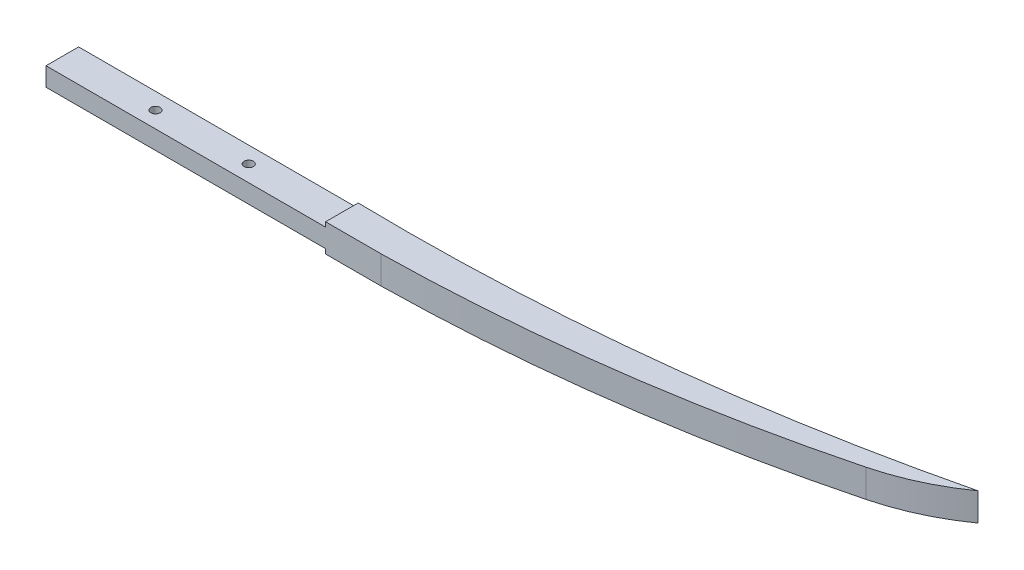
ISO-10303-21;
HEADER;
FILE_DESCRIPTION(('STEP AP214'),'2;1');
FILE_NAME('part.step','',(''),(''),'','','');
FILE_SCHEMA(('AUTOMOTIVE_DESIGN { 1 0 10303 214 1 1 1 1 }'));
ENDSEC;
DATA;
#1=APPLICATION_CONTEXT('core data for automotive mechanical design processes');
#2=APPLICATION_PROTOCOL_DEFINITION('international standard','automotive_design',2000,#1);
#3=PRODUCT_CONTEXT('',#1,'mechanical');
#4=PRODUCT('Part','Part','',(#3));
#5=PRODUCT_RELATED_PRODUCT_CATEGORY('part','',(#4));
#6=PRODUCT_DEFINITION_FORMATION('','',#4);
#7=PRODUCT_DEFINITION_CONTEXT('part definition',#1,'design');
#8=PRODUCT_DEFINITION('design','',#6,#7);
#9=PRODUCT_DEFINITION_SHAPE('','',#8);
#10=(LENGTH_UNIT() NAMED_UNIT(*) SI_UNIT(.MILLI.,.METRE.));
#11=(NAMED_UNIT(*) PLANE_ANGLE_UNIT() SI_UNIT($,.RADIAN.));
#12=(NAMED_UNIT(*) SI_UNIT($,.STERADIAN.) SOLID_ANGLE_UNIT());
#13=UNCERTAINTY_MEASURE_WITH_UNIT(LENGTH_MEASURE(1.E-05),#10,'distance_accuracy_value','');
#14=(GEOMETRIC_REPRESENTATION_CONTEXT(3) GLOBAL_UNCERTAINTY_ASSIGNED_CONTEXT((#13)) GLOBAL_UNIT_ASSIGNED_CONTEXT((#10,
#11,#12)) REPRESENTATION_CONTEXT('',''));
#15=CARTESIAN_POINT('',(0.,0.,0.));
#16=DIRECTION('',(0.,0.,1.));
#17=DIRECTION('',(1.,0.,0.));
#18=AXIS2_PLACEMENT_3D('',#15,#16,#17);
#19=CARTESIAN_POINT('',(0.,30.,0.));
#20=DIRECTION('',(1.,0.,0.));
#21=DIRECTION('',(0.,0.,-1.));
#22=AXIS2_PLACEMENT_3D('',#19,#20,#21);
#23=PLANE('',#22);
#24=DIRECTION('',(0.,0.,1.));
#25=VECTOR('',#24,1.);
#26=CARTESIAN_POINT('',(0.,5.,-35.0000000000001));
#27=LINE('',#26,#25);
#28=CARTESIAN_POINT('',(0.,5.,-35.0000000000001));
#29=VERTEX_POINT('',#28);
#30=CARTESIAN_POINT('',(0.,5.,0.));
#31=VERTEX_POINT('',#30);
#32=EDGE_CURVE('E58',#29,#31,#27,.T.);
#33=ORIENTED_EDGE('',*,*,#32,.F.);
#34=DIRECTION('',(0.,-1.,0.));
#35=VECTOR('',#34,1.);
#36=CARTESIAN_POINT('',(0.,30.,-35.0000000000001));
#37=LINE('',#36,#35);
#38=CARTESIAN_POINT('',(0.,0.,-35.0000000000001));
#39=VERTEX_POINT('',#38);
#40=EDGE_CURVE('E188',#29,#39,#37,.T.);
#41=ORIENTED_EDGE('',*,*,#40,.T.);
#42=DIRECTION('',(0.,0.,1.));
#43=VECTOR('',#42,1.);
#44=CARTESIAN_POINT('',(0.,0.,0.));
#45=LINE('',#44,#43);
#46=CARTESIAN_POINT('',(0.,0.,0.));
#47=VERTEX_POINT('',#46);
#48=EDGE_CURVE('E178',#39,#47,#45,.T.);
#49=ORIENTED_EDGE('',*,*,#48,.T.);
#50=DIRECTION('',(0.,-1.,0.));
#51=VECTOR('',#50,1.);
#52=CARTESIAN_POINT('',(0.,30.,0.));
#53=LINE('',#52,#51);
#54=EDGE_CURVE('E63',#31,#47,#53,.T.);
#55=ORIENTED_EDGE('',*,*,#54,.F.);
#56=EDGE_LOOP('',(#33,#41,#49,#55));
#57=FACE_BOUND('',#56,.T.);
#58=ADVANCED_FACE('F41',(#57),#23,.F.);
#59=DIRECTION('',(0.,0.,-1.));
#60=VECTOR('',#59,1.);
#61=CARTESIAN_POINT('',(0.,25.,0.));
#62=LINE('',#61,#60);
#63=CARTESIAN_POINT('',(0.,25.,0.));
#64=VERTEX_POINT('',#63);
#65=CARTESIAN_POINT('',(0.,25.,-35.0000000000001));
#66=VERTEX_POINT('',#65);
#67=EDGE_CURVE('E225',#64,#66,#62,.T.);
#68=ORIENTED_EDGE('',*,*,#67,.F.);
#69=CARTESIAN_POINT('',(0.,30.,0.));
#70=VERTEX_POINT('',#69);
#71=EDGE_CURVE('E139',#70,#64,#53,.T.);
#72=ORIENTED_EDGE('',*,*,#71,.F.);
#73=DIRECTION('',(0.,0.,1.));
#74=VECTOR('',#73,1.);
#75=CARTESIAN_POINT('',(0.,30.,0.));
#76=LINE('',#75,#74);
#77=CARTESIAN_POINT('',(0.,30.,-35.0000000000001));
#78=VERTEX_POINT('',#77);
#79=EDGE_CURVE('E164',#78,#70,#76,.T.);
#80=ORIENTED_EDGE('',*,*,#79,.F.);
#81=EDGE_CURVE('E189',#78,#66,#37,.T.);
#82=ORIENTED_EDGE('',*,*,#81,.T.);
#83=EDGE_LOOP('',(#68,#72,#80,#82));
#84=FACE_BOUND('',#83,.T.);
#85=ADVANCED_FACE('F260',(#84),#23,.F.);
#86=CARTESIAN_POINT('',(29.7232753436048,30.,-1949.77345527701));
#87=DIRECTION('',(0.,-1.,0.));
#88=DIRECTION('',(0.,0.,-1.));
#89=AXIS2_PLACEMENT_3D('',#86,#87,#88);
#90=CYLINDRICAL_SURFACE('',#89,1950.);
#91=CARTESIAN_POINT('',(29.7232753436048,0.,-1949.77345527701));
#92=DIRECTION('',(0.,1.,0.));
#93=DIRECTION('',(0.,0.,1.));
#94=AXIS2_PLACEMENT_3D('',#91,#92,#93);
#95=CIRCLE('',#94,1950.);
#96=CARTESIAN_POINT('',(59.4465506872079,0.,0.));
#97=VERTEX_POINT('',#96);
#98=CARTESIAN_POINT('',(517.979369234719,0.,-61.8894581049922));
#99=VERTEX_POINT('',#98);
#100=EDGE_CURVE('E141',#97,#99,#95,.T.);
#101=ORIENTED_EDGE('',*,*,#100,.T.);
#102=DIRECTION('',(0.,-1.,0.));
#103=VECTOR('',#102,1.);
#104=CARTESIAN_POINT('',(517.979369234719,30.,-61.8894581049922));
#105=LINE('',#104,#103);
#106=CARTESIAN_POINT('',(517.979369234719,30.,-61.8894581049922));
#107=VERTEX_POINT('',#106);
#108=EDGE_CURVE('E11',#107,#99,#105,.T.);
#109=ORIENTED_EDGE('',*,*,#108,.F.);
#110=CARTESIAN_POINT('',(29.7232753436048,30.,-1949.77345527701));
#111=DIRECTION('',(0.,1.,0.));
#112=DIRECTION('',(0.,0.,1.));
#113=AXIS2_PLACEMENT_3D('',#110,#111,#112);
#114=CIRCLE('',#113,1950.);
#115=CARTESIAN_POINT('',(59.4465506872079,30.,0.));
#116=VERTEX_POINT('',#115);
#117=EDGE_CURVE('E152',#116,#107,#114,.T.);
#118=ORIENTED_EDGE('',*,*,#117,.F.);
#119=DIRECTION('',(0.,-1.,0.));
#120=VECTOR('',#119,1.);
#121=CARTESIAN_POINT('',(59.4465506872079,30.,0.));
#122=LINE('',#121,#120);
#123=EDGE_CURVE('E169',#116,#97,#122,.T.);
#124=ORIENTED_EDGE('',*,*,#123,.T.);
#125=EDGE_LOOP('',(#101,#109,#118,#124));
#126=FACE_BOUND('',#125,.T.);
#127=ADVANCED_FACE('F43',(#126),#90,.T.);
#128=CARTESIAN_POINT('',(455.382434120473,30.,-303.925867998841));
#129=DIRECTION('',(0.,-1.,0.));
#130=DIRECTION('',(0.,0.,-1.));
#131=AXIS2_PLACEMENT_3D('',#128,#129,#130);
#132=CYLINDRICAL_SURFACE('',#131,250.);
#133=CARTESIAN_POINT('',(455.382434120473,0.,-303.925867998841));
#134=DIRECTION('',(0.,1.,0.));
#135=DIRECTION('',(0.,0.,1.));
#136=AXIS2_PLACEMENT_3D('',#133,#134,#135);
#137=CIRCLE('',#136,250.);
#138=CARTESIAN_POINT('',(600.,0.,-100.));
#139=VERTEX_POINT('',#138);
#140=EDGE_CURVE('E146',#99,#139,#137,.T.);
#141=ORIENTED_EDGE('',*,*,#140,.T.);
#142=DIRECTION('',(0.,-1.,0.));
#143=VECTOR('',#142,1.);
#144=CARTESIAN_POINT('',(600.,30.,-100.));
#145=LINE('',#144,#143);
#146=CARTESIAN_POINT('',(600.,30.,-100.));
#147=VERTEX_POINT('',#146);
#148=EDGE_CURVE('E51',#147,#139,#145,.T.);
#149=ORIENTED_EDGE('',*,*,#148,.F.);
#150=CARTESIAN_POINT('',(455.382434120473,30.,-303.925867998841));
#151=DIRECTION('',(0.,1.,0.));
#152=DIRECTION('',(0.,0.,1.));
#153=AXIS2_PLACEMENT_3D('',#150,#151,#152);
#154=CIRCLE('',#153,250.);
#155=EDGE_CURVE('E156',#107,#147,#154,.T.);
#156=ORIENTED_EDGE('',*,*,#155,.F.);
#157=ORIENTED_EDGE('',*,*,#108,.T.);
#158=EDGE_LOOP('',(#141,#149,#156,#157));
#159=FACE_BOUND('',#158,.T.);
#160=ADVANCED_FACE('F199',(#159),#132,.T.);
#161=CARTESIAN_POINT('',(48.9928320212939,30.,-2384.48924288036));
#162=DIRECTION('',(0.,-1.,0.));
#163=DIRECTION('',(0.,0.,-1.));
#164=AXIS2_PLACEMENT_3D('',#161,#162,#163);
#165=CYLINDRICAL_SURFACE('',#164,2350.);
#166=CARTESIAN_POINT('',(48.9928320212939,0.,-2384.48924288036));
#167=DIRECTION('',(0.,1.,0.));
#168=DIRECTION('',(0.,0.,1.));
#169=AXIS2_PLACEMENT_3D('',#166,#167,#168);
#170=CIRCLE('',#169,2350.);
#171=EDGE_CURVE('E174',#39,#139,#170,.T.);
#172=ORIENTED_EDGE('',*,*,#171,.F.);
#173=ORIENTED_EDGE('',*,*,#40,.F.);
#174=DIRECTION('',(0.,-1.,0.));
#175=VECTOR('',#174,1.);
#176=CARTESIAN_POINT('',(0.,5.,-35.0000000000001));
#177=LINE('',#176,#175);
#178=EDGE_CURVE('E222',#66,#29,#177,.T.);
#179=ORIENTED_EDGE('',*,*,#178,.F.);
#180=ORIENTED_EDGE('',*,*,#81,.F.);
#181=CARTESIAN_POINT('',(48.9928320212939,30.,-2384.48924288036));
#182=DIRECTION('',(0.,1.,0.));
#183=DIRECTION('',(0.,0.,1.));
#184=AXIS2_PLACEMENT_3D('',#181,#182,#183);
#185=CIRCLE('',#184,2350.);
#186=EDGE_CURVE('E160',#78,#147,#185,.T.);
#187=ORIENTED_EDGE('',*,*,#186,.T.);
#188=ORIENTED_EDGE('',*,*,#148,.T.);
#189=EDGE_LOOP('',(#172,#173,#179,#180,#187,#188));
#190=FACE_BOUND('',#189,.T.);
#191=ADVANCED_FACE('F196',(#190),#165,.F.);
#192=CARTESIAN_POINT('',(0.,30.,0.));
#193=DIRECTION('',(0.,0.,-1.));
#194=DIRECTION('',(-1.,0.,0.));
#195=AXIS2_PLACEMENT_3D('',#192,#193,#194);
#196=PLANE('',#195);
#197=DIRECTION('',(1.,0.,0.));
#198=VECTOR('',#197,1.);
#199=CARTESIAN_POINT('',(0.,0.,0.));
#200=LINE('',#199,#198);
#201=EDGE_CURVE('E157',#47,#97,#200,.T.);
#202=ORIENTED_EDGE('',*,*,#201,.T.);
#203=ORIENTED_EDGE('',*,*,#123,.F.);
#204=DIRECTION('',(1.,0.,0.));
#205=VECTOR('',#204,1.);
#206=CARTESIAN_POINT('',(0.,30.,0.));
#207=LINE('',#206,#205);
#208=EDGE_CURVE('E167',#70,#116,#207,.T.);
#209=ORIENTED_EDGE('',*,*,#208,.F.);
#210=ORIENTED_EDGE('',*,*,#71,.T.);
#211=DIRECTION('',(1.,0.,0.));
#212=VECTOR('',#211,1.);
#213=CARTESIAN_POINT('',(-300.,25.,0.));
#214=LINE('',#213,#212);
#215=CARTESIAN_POINT('',(-300.,25.,0.));
#216=VERTEX_POINT('',#215);
#217=EDGE_CURVE('E117',#216,#64,#214,.T.);
#218=ORIENTED_EDGE('',*,*,#217,.F.);
#219=DIRECTION('',(0.,1.,0.));
#220=VECTOR('',#219,1.);
#221=CARTESIAN_POINT('',(-300.,5.,0.));
#222=LINE('',#221,#220);
#223=CARTESIAN_POINT('',(-300.,5.,0.));
#224=VERTEX_POINT('',#223);
#225=EDGE_CURVE('E124',#224,#216,#222,.T.);
#226=ORIENTED_EDGE('',*,*,#225,.F.);
#227=DIRECTION('',(1.,0.,0.));
#228=VECTOR('',#227,1.);
#229=CARTESIAN_POINT('',(-300.,5.,0.));
#230=LINE('',#229,#228);
#231=EDGE_CURVE('E211',#224,#31,#230,.T.);
#232=ORIENTED_EDGE('',*,*,#231,.T.);
#233=ORIENTED_EDGE('',*,*,#54,.T.);
#234=EDGE_LOOP('',(#202,#203,#209,#210,#218,#226,#232,#233));
#235=FACE_BOUND('',#234,.T.);
#236=ADVANCED_FACE('F136',(#235),#196,.F.);
#237=CARTESIAN_POINT('',(0.,30.,0.));
#238=DIRECTION('',(0.,1.,0.));
#239=DIRECTION('',(0.,0.,1.));
#240=AXIS2_PLACEMENT_3D('',#237,#238,#239);
#241=PLANE('',#240);
#242=ORIENTED_EDGE('',*,*,#117,.T.);
#243=ORIENTED_EDGE('',*,*,#155,.T.);
#244=ORIENTED_EDGE('',*,*,#186,.F.);
#245=ORIENTED_EDGE('',*,*,#79,.T.);
#246=ORIENTED_EDGE('',*,*,#208,.T.);
#247=EDGE_LOOP('',(#242,#243,#244,#245,#246));
#248=FACE_BOUND('',#247,.T.);
#249=ADVANCED_FACE('F279',(#248),#241,.T.);
#250=CARTESIAN_POINT('',(0.,0.,0.));
#251=DIRECTION('',(0.,1.,0.));
#252=DIRECTION('',(0.,0.,1.));
#253=AXIS2_PLACEMENT_3D('',#250,#251,#252);
#254=PLANE('',#253);
#255=ORIENTED_EDGE('',*,*,#100,.F.);
#256=ORIENTED_EDGE('',*,*,#201,.F.);
#257=ORIENTED_EDGE('',*,*,#48,.F.);
#258=ORIENTED_EDGE('',*,*,#171,.T.);
#259=ORIENTED_EDGE('',*,*,#140,.F.);
#260=EDGE_LOOP('',(#255,#256,#257,#258,#259));
#261=FACE_BOUND('',#260,.T.);
#262=ADVANCED_FACE('F204',(#261),#254,.F.);
#263=CARTESIAN_POINT('',(-300.,25.,0.));
#264=DIRECTION('',(0.,-1.,0.));
#265=DIRECTION('',(0.,0.,-1.));
#266=AXIS2_PLACEMENT_3D('',#263,#264,#265);
#267=PLANE('',#266);
#268=CARTESIAN_POINT('',(-200.,25.,-17.5));
#269=DIRECTION('',(0.,1.,0.));
#270=DIRECTION('',(0.,0.,1.));
#271=AXIS2_PLACEMENT_3D('',#268,#269,#270);
#272=CIRCLE('',#271,5.);
#273=CARTESIAN_POINT('',(-200.,25.,-12.5));
#274=VERTEX_POINT('',#273);
#275=EDGE_CURVE('E238',#274,#274,#272,.T.);
#276=ORIENTED_EDGE('',*,*,#275,.F.);
#277=EDGE_LOOP('',(#276));
#278=FACE_BOUND('',#277,.T.);
#279=CARTESIAN_POINT('',(-100.,25.,-17.5));
#280=DIRECTION('',(0.,1.,0.));
#281=DIRECTION('',(0.,0.,1.));
#282=AXIS2_PLACEMENT_3D('',#279,#280,#281);
#283=CIRCLE('',#282,5.);
#284=CARTESIAN_POINT('',(-100.,25.,-12.5));
#285=VERTEX_POINT('',#284);
#286=EDGE_CURVE('E234',#285,#285,#283,.T.);
#287=ORIENTED_EDGE('',*,*,#286,.F.);
#288=EDGE_LOOP('',(#287));
#289=FACE_BOUND('',#288,.T.);
#290=ORIENTED_EDGE('',*,*,#67,.T.);
#291=DIRECTION('',(1.,0.,0.));
#292=VECTOR('',#291,1.);
#293=CARTESIAN_POINT('',(-300.,25.,-35.0000000000002));
#294=LINE('',#293,#292);
#295=CARTESIAN_POINT('',(-300.,25.,-35.0000000000002));
#296=VERTEX_POINT('',#295);
#297=EDGE_CURVE('E119',#296,#66,#294,.T.);
#298=ORIENTED_EDGE('',*,*,#297,.F.);
#299=DIRECTION('',(0.,0.,-1.));
#300=VECTOR('',#299,1.);
#301=CARTESIAN_POINT('',(-300.,25.,0.));
#302=LINE('',#301,#300);
#303=EDGE_CURVE('E112',#216,#296,#302,.T.);
#304=ORIENTED_EDGE('',*,*,#303,.F.);
#305=ORIENTED_EDGE('',*,*,#217,.T.);
#306=EDGE_LOOP('',(#290,#298,#304,#305));
#307=FACE_BOUND('',#306,.T.);
#308=ADVANCED_FACE('F115',(#278,#289,#307),#267,.F.);
#309=CARTESIAN_POINT('',(-300.,5.,-35.0000000000002));
#310=DIRECTION('',(0.,0.,1.));
#311=DIRECTION('',(1.,0.,0.));
#312=AXIS2_PLACEMENT_3D('',#309,#310,#311);
#313=PLANE('',#312);
#314=ORIENTED_EDGE('',*,*,#178,.T.);
#315=DIRECTION('',(1.,0.,0.));
#316=VECTOR('',#315,1.);
#317=CARTESIAN_POINT('',(-300.,5.,-35.0000000000002));
#318=LINE('',#317,#316);
#319=CARTESIAN_POINT('',(-300.,5.,-35.0000000000002));
#320=VERTEX_POINT('',#319);
#321=EDGE_CURVE('E148',#320,#29,#318,.T.);
#322=ORIENTED_EDGE('',*,*,#321,.F.);
#323=DIRECTION('',(0.,-1.,0.));
#324=VECTOR('',#323,1.);
#325=CARTESIAN_POINT('',(-300.,5.,-35.0000000000002));
#326=LINE('',#325,#324);
#327=EDGE_CURVE('E123',#296,#320,#326,.T.);
#328=ORIENTED_EDGE('',*,*,#327,.F.);
#329=ORIENTED_EDGE('',*,*,#297,.T.);
#330=EDGE_LOOP('',(#314,#322,#328,#329));
#331=FACE_BOUND('',#330,.T.);
#332=ADVANCED_FACE('F282',(#331),#313,.F.);
#333=CARTESIAN_POINT('',(-300.,5.,-35.0000000000002));
#334=DIRECTION('',(0.,1.,0.));
#335=DIRECTION('',(0.,0.,1.));
#336=AXIS2_PLACEMENT_3D('',#333,#334,#335);
#337=PLANE('',#336);
#338=CARTESIAN_POINT('',(-200.,5.,-17.5));
#339=DIRECTION('',(0.,1.,0.));
#340=DIRECTION('',(0.,0.,1.));
#341=AXIS2_PLACEMENT_3D('',#338,#339,#340);
#342=CIRCLE('',#341,5.);
#343=CARTESIAN_POINT('',(-200.,5.,-12.5));
#344=VERTEX_POINT('',#343);
#345=EDGE_CURVE('E45',#344,#344,#342,.T.);
#346=ORIENTED_EDGE('',*,*,#345,.T.);
#347=EDGE_LOOP('',(#346));
#348=FACE_BOUND('',#347,.T.);
#349=CARTESIAN_POINT('',(-100.,5.,-17.5));
#350=DIRECTION('',(0.,1.,0.));
#351=DIRECTION('',(0.,0.,1.));
#352=AXIS2_PLACEMENT_3D('',#349,#350,#351);
#353=CIRCLE('',#352,5.);
#354=CARTESIAN_POINT('',(-100.,5.,-12.5));
#355=VERTEX_POINT('',#354);
#356=EDGE_CURVE('E227',#355,#355,#353,.T.);
#357=ORIENTED_EDGE('',*,*,#356,.T.);
#358=EDGE_LOOP('',(#357));
#359=FACE_BOUND('',#358,.T.);
#360=ORIENTED_EDGE('',*,*,#32,.T.);
#361=ORIENTED_EDGE('',*,*,#231,.F.);
#362=DIRECTION('',(0.,0.,1.));
#363=VECTOR('',#362,1.);
#364=CARTESIAN_POINT('',(-300.,5.,-35.0000000000002));
#365=LINE('',#364,#363);
#366=EDGE_CURVE('E129',#320,#224,#365,.T.);
#367=ORIENTED_EDGE('',*,*,#366,.F.);
#368=ORIENTED_EDGE('',*,*,#321,.T.);
#369=EDGE_LOOP('',(#360,#361,#367,#368));
#370=FACE_BOUND('',#369,.T.);
#371=ADVANCED_FACE('F247',(#348,#359,#370),#337,.F.);
#372=CARTESIAN_POINT('',(-300.,0.,0.));
#373=DIRECTION('',(-1.,0.,0.));
#374=DIRECTION('',(0.,0.,1.));
#375=AXIS2_PLACEMENT_3D('',#372,#373,#374);
#376=PLANE('',#375);
#377=ORIENTED_EDGE('',*,*,#225,.T.);
#378=ORIENTED_EDGE('',*,*,#303,.T.);
#379=ORIENTED_EDGE('',*,*,#327,.T.);
#380=ORIENTED_EDGE('',*,*,#366,.T.);
#381=EDGE_LOOP('',(#377,#378,#379,#380));
#382=FACE_BOUND('',#381,.T.);
#383=ADVANCED_FACE('F127',(#382),#376,.T.);
#384=CARTESIAN_POINT('',(-100.,25.,-17.5));
#385=DIRECTION('',(0.,1.,0.));
#386=DIRECTION('',(0.,0.,1.));
#387=AXIS2_PLACEMENT_3D('',#384,#385,#386);
#388=CYLINDRICAL_SURFACE('',#387,5.);
#389=ORIENTED_EDGE('',*,*,#286,.T.);
#390=EDGE_LOOP('',(#389));
#391=FACE_BOUND('',#390,.T.);
#392=ORIENTED_EDGE('',*,*,#356,.F.);
#393=EDGE_LOOP('',(#392));
#394=FACE_BOUND('',#393,.T.);
#395=ADVANCED_FACE('F252',(#391,#394),#388,.F.);
#396=CARTESIAN_POINT('',(-200.,25.,-17.5));
#397=DIRECTION('',(0.,1.,0.));
#398=DIRECTION('',(0.,0.,1.));
#399=AXIS2_PLACEMENT_3D('',#396,#397,#398);
#400=CYLINDRICAL_SURFACE('',#399,5.);
#401=ORIENTED_EDGE('',*,*,#275,.T.);
#402=EDGE_LOOP('',(#401));
#403=FACE_BOUND('',#402,.T.);
#404=ORIENTED_EDGE('',*,*,#345,.F.);
#405=EDGE_LOOP('',(#404));
#406=FACE_BOUND('',#405,.T.);
#407=ADVANCED_FACE('F250',(#403,#406),#400,.F.);
#408=CLOSED_SHELL('',(#58,#85,#127,#160,#191,#236,#249,#262,#308,#332,#371,#383,#395,#407));
#409=MANIFOLD_SOLID_BREP('B2',#408);
#410=ADVANCED_BREP_SHAPE_REPRESENTATION('',(#18,#409),#14);
#411=SHAPE_DEFINITION_REPRESENTATION(#9,#410);
ENDSEC;
END-ISO-10303-21;
